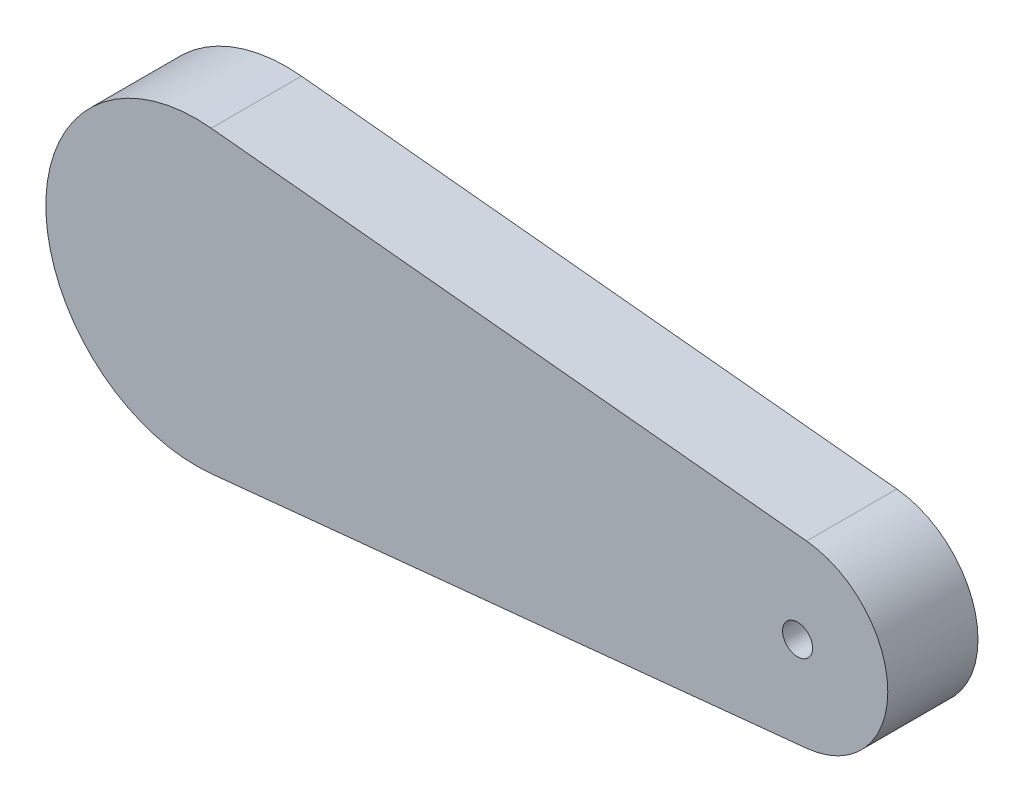
ISO-10303-21;
HEADER;
FILE_DESCRIPTION(('STEP AP214'),'2;1');
FILE_NAME('part.step','',(''),(''),'','','');
FILE_SCHEMA(('AUTOMOTIVE_DESIGN { 1 0 10303 214 1 1 1 1 }'));
ENDSEC;
DATA;
#1=APPLICATION_CONTEXT('core data for automotive mechanical design processes');
#2=APPLICATION_PROTOCOL_DEFINITION('international standard','automotive_design',2000,#1);
#3=PRODUCT_CONTEXT('',#1,'mechanical');
#4=PRODUCT('Part','Part','',(#3));
#5=PRODUCT_RELATED_PRODUCT_CATEGORY('part','',(#4));
#6=PRODUCT_DEFINITION_FORMATION('','',#4);
#7=PRODUCT_DEFINITION_CONTEXT('part definition',#1,'design');
#8=PRODUCT_DEFINITION('design','',#6,#7);
#9=PRODUCT_DEFINITION_SHAPE('','',#8);
#10=(LENGTH_UNIT() NAMED_UNIT(*) SI_UNIT(.MILLI.,.METRE.));
#11=(NAMED_UNIT(*) PLANE_ANGLE_UNIT() SI_UNIT($,.RADIAN.));
#12=(NAMED_UNIT(*) SI_UNIT($,.STERADIAN.) SOLID_ANGLE_UNIT());
#13=UNCERTAINTY_MEASURE_WITH_UNIT(LENGTH_MEASURE(1.E-05),#10,'distance_accuracy_value','');
#14=(GEOMETRIC_REPRESENTATION_CONTEXT(3) GLOBAL_UNCERTAINTY_ASSIGNED_CONTEXT((#13)) GLOBAL_UNIT_ASSIGNED_CONTEXT((#10,
#11,#12)) REPRESENTATION_CONTEXT('',''));
#15=CARTESIAN_POINT('',(0.,0.,0.));
#16=DIRECTION('',(0.,0.,1.));
#17=DIRECTION('',(1.,0.,0.));
#18=AXIS2_PLACEMENT_3D('',#15,#16,#17);
#19=CARTESIAN_POINT('',(0.,0.,30.));
#20=DIRECTION('',(0.,0.,-1.));
#21=DIRECTION('',(-1.,0.,0.));
#22=AXIS2_PLACEMENT_3D('',#19,#20,#21);
#23=CYLINDRICAL_SURFACE('',#22,50.);
#24=CARTESIAN_POINT('',(0.,0.,0.));
#25=DIRECTION('',(0.,0.,1.));
#26=DIRECTION('',(1.,0.,0.));
#27=AXIS2_PLACEMENT_3D('',#24,#25,#26);
#28=CIRCLE('',#27,50.);
#29=CARTESIAN_POINT('',(5.,49.749371855331,0.));
#30=VERTEX_POINT('',#29);
#31=CARTESIAN_POINT('',(5.,-49.749371855331,0.));
#32=VERTEX_POINT('',#31);
#33=EDGE_CURVE('E97',#30,#32,#28,.T.);
#34=ORIENTED_EDGE('',*,*,#33,.T.);
#35=DIRECTION('',(0.,0.,-1.));
#36=VECTOR('',#35,1.);
#37=CARTESIAN_POINT('',(5.,-49.749371855331,30.));
#38=LINE('',#37,#36);
#39=CARTESIAN_POINT('',(5.,-49.749371855331,30.));
#40=VERTEX_POINT('',#39);
#41=EDGE_CURVE('E11',#40,#32,#38,.T.);
#42=ORIENTED_EDGE('',*,*,#41,.F.);
#43=CARTESIAN_POINT('',(0.,0.,30.));
#44=DIRECTION('',(0.,0.,1.));
#45=DIRECTION('',(1.,0.,0.));
#46=AXIS2_PLACEMENT_3D('',#43,#44,#45);
#47=CIRCLE('',#46,50.);
#48=CARTESIAN_POINT('',(5.,49.749371855331,30.));
#49=VERTEX_POINT('',#48);
#50=EDGE_CURVE('E85',#49,#40,#47,.T.);
#51=ORIENTED_EDGE('',*,*,#50,.F.);
#52=DIRECTION('',(0.,0.,-1.));
#53=VECTOR('',#52,1.);
#54=CARTESIAN_POINT('',(5.,49.749371855331,30.));
#55=LINE('',#54,#53);
#56=EDGE_CURVE('E93',#49,#30,#55,.T.);
#57=ORIENTED_EDGE('',*,*,#56,.T.);
#58=EDGE_LOOP('',(#34,#42,#51,#57));
#59=FACE_BOUND('',#58,.T.);
#60=ADVANCED_FACE('F34',(#59),#23,.T.);
#61=CARTESIAN_POINT('',(5.,-49.749371855331,30.));
#62=DIRECTION('',(-0.1,0.99498743710662,0.));
#63=DIRECTION('',(-0.99498743710662,-0.1,0.));
#64=AXIS2_PLACEMENT_3D('',#61,#62,#63);
#65=PLANE('',#64);
#66=DIRECTION('',(0.99498743710662,0.1,0.));
#67=VECTOR('',#66,1.);
#68=CARTESIAN_POINT('',(5.,-49.749371855331,0.));
#69=LINE('',#68,#67);
#70=CARTESIAN_POINT('',(203.,-29.8496231131986,0.));
#71=VERTEX_POINT('',#70);
#72=EDGE_CURVE('E89',#32,#71,#69,.T.);
#73=ORIENTED_EDGE('',*,*,#72,.T.);
#74=DIRECTION('',(0.,0.,-1.));
#75=VECTOR('',#74,1.);
#76=CARTESIAN_POINT('',(203.,-29.8496231131986,30.));
#77=LINE('',#76,#75);
#78=CARTESIAN_POINT('',(203.,-29.8496231131986,30.));
#79=VERTEX_POINT('',#78);
#80=EDGE_CURVE('E42',#79,#71,#77,.T.);
#81=ORIENTED_EDGE('',*,*,#80,.F.);
#82=DIRECTION('',(0.99498743710662,0.1,0.));
#83=VECTOR('',#82,1.);
#84=CARTESIAN_POINT('',(5.,-49.749371855331,30.));
#85=LINE('',#84,#83);
#86=EDGE_CURVE('E80',#40,#79,#85,.T.);
#87=ORIENTED_EDGE('',*,*,#86,.F.);
#88=ORIENTED_EDGE('',*,*,#41,.T.);
#89=EDGE_LOOP('',(#73,#81,#87,#88));
#90=FACE_BOUND('',#89,.T.);
#91=ADVANCED_FACE('F88',(#90),#65,.F.);
#92=CARTESIAN_POINT('',(200.,0.,30.));
#93=DIRECTION('',(0.,0.,-1.));
#94=DIRECTION('',(-1.,0.,0.));
#95=AXIS2_PLACEMENT_3D('',#92,#93,#94);
#96=CYLINDRICAL_SURFACE('',#95,30.);
#97=CARTESIAN_POINT('',(200.,0.,0.));
#98=DIRECTION('',(0.,0.,1.));
#99=DIRECTION('',(1.,0.,0.));
#100=AXIS2_PLACEMENT_3D('',#97,#98,#99);
#101=CIRCLE('',#100,30.);
#102=CARTESIAN_POINT('',(203.,29.8496231131986,0.));
#103=VERTEX_POINT('',#102);
#104=EDGE_CURVE('E67',#71,#103,#101,.T.);
#105=ORIENTED_EDGE('',*,*,#104,.T.);
#106=DIRECTION('',(0.,0.,-1.));
#107=VECTOR('',#106,1.);
#108=CARTESIAN_POINT('',(203.,29.8496231131986,30.));
#109=LINE('',#108,#107);
#110=CARTESIAN_POINT('',(203.,29.8496231131986,30.));
#111=VERTEX_POINT('',#110);
#112=EDGE_CURVE('E90',#111,#103,#109,.T.);
#113=ORIENTED_EDGE('',*,*,#112,.F.);
#114=CARTESIAN_POINT('',(200.,0.,30.));
#115=DIRECTION('',(0.,0.,1.));
#116=DIRECTION('',(1.,0.,0.));
#117=AXIS2_PLACEMENT_3D('',#114,#115,#116);
#118=CIRCLE('',#117,30.);
#119=EDGE_CURVE('E83',#79,#111,#118,.T.);
#120=ORIENTED_EDGE('',*,*,#119,.F.);
#121=ORIENTED_EDGE('',*,*,#80,.T.);
#122=EDGE_LOOP('',(#105,#113,#120,#121));
#123=FACE_BOUND('',#122,.T.);
#124=ADVANCED_FACE('F91',(#123),#96,.T.);
#125=CARTESIAN_POINT('',(5.,49.749371855331,30.));
#126=DIRECTION('',(-0.1,-0.99498743710662,0.));
#127=DIRECTION('',(0.99498743710662,-0.1,0.));
#128=AXIS2_PLACEMENT_3D('',#125,#126,#127);
#129=PLANE('',#128);
#130=DIRECTION('',(-0.99498743710662,0.1,0.));
#131=VECTOR('',#130,1.);
#132=CARTESIAN_POINT('',(5.,49.749371855331,0.));
#133=LINE('',#132,#131);
#134=EDGE_CURVE('E73',#103,#30,#133,.T.);
#135=ORIENTED_EDGE('',*,*,#134,.T.);
#136=ORIENTED_EDGE('',*,*,#56,.F.);
#137=DIRECTION('',(-0.99498743710662,0.1,0.));
#138=VECTOR('',#137,1.);
#139=CARTESIAN_POINT('',(5.,49.749371855331,30.));
#140=LINE('',#139,#138);
#141=EDGE_CURVE('E50',#111,#49,#140,.T.);
#142=ORIENTED_EDGE('',*,*,#141,.F.);
#143=ORIENTED_EDGE('',*,*,#112,.T.);
#144=EDGE_LOOP('',(#135,#136,#142,#143));
#145=FACE_BOUND('',#144,.T.);
#146=ADVANCED_FACE('F105',(#145),#129,.F.);
#147=CARTESIAN_POINT('',(0.,0.,30.));
#148=DIRECTION('',(0.,0.,1.));
#149=DIRECTION('',(1.,0.,0.));
#150=AXIS2_PLACEMENT_3D('',#147,#148,#149);
#151=PLANE('',#150);
#152=CARTESIAN_POINT('',(200.,0.,30.));
#153=DIRECTION('',(0.,0.,1.));
#154=DIRECTION('',(1.,0.,0.));
#155=AXIS2_PLACEMENT_3D('',#152,#153,#154);
#156=CIRCLE('',#155,4.99999999999999);
#157=CARTESIAN_POINT('',(205.,0.,30.));
#158=VERTEX_POINT('',#157);
#159=EDGE_CURVE('E117',#158,#158,#156,.T.);
#160=ORIENTED_EDGE('',*,*,#159,.F.);
#161=EDGE_LOOP('',(#160));
#162=FACE_BOUND('',#161,.T.);
#163=ORIENTED_EDGE('',*,*,#50,.T.);
#164=ORIENTED_EDGE('',*,*,#86,.T.);
#165=ORIENTED_EDGE('',*,*,#119,.T.);
#166=ORIENTED_EDGE('',*,*,#141,.T.);
#167=EDGE_LOOP('',(#163,#164,#165,#166));
#168=FACE_BOUND('',#167,.T.);
#169=ADVANCED_FACE('F81',(#162,#168),#151,.T.);
#170=CARTESIAN_POINT('',(0.,0.,0.));
#171=DIRECTION('',(0.,0.,1.));
#172=DIRECTION('',(1.,0.,0.));
#173=AXIS2_PLACEMENT_3D('',#170,#171,#172);
#174=PLANE('',#173);
#175=CARTESIAN_POINT('',(0.,0.,0.));
#176=DIRECTION('',(0.,0.,-1.));
#177=DIRECTION('',(-1.,0.,0.));
#178=AXIS2_PLACEMENT_3D('',#175,#176,#177);
#179=CIRCLE('',#178,5.);
#180=CARTESIAN_POINT('',(-5.,0.,0.));
#181=VERTEX_POINT('',#180);
#182=EDGE_CURVE('E111',#181,#181,#179,.T.);
#183=ORIENTED_EDGE('',*,*,#182,.F.);
#184=EDGE_LOOP('',(#183));
#185=FACE_BOUND('',#184,.T.);
#186=ORIENTED_EDGE('',*,*,#33,.F.);
#187=ORIENTED_EDGE('',*,*,#134,.F.);
#188=ORIENTED_EDGE('',*,*,#104,.F.);
#189=ORIENTED_EDGE('',*,*,#72,.F.);
#190=EDGE_LOOP('',(#186,#187,#188,#189));
#191=FACE_BOUND('',#190,.T.);
#192=ADVANCED_FACE('F108',(#185,#191),#174,.F.);
#193=CARTESIAN_POINT('',(0.,0.,10.));
#194=DIRECTION('',(0.,0.,-1.));
#195=DIRECTION('',(-1.,0.,0.));
#196=AXIS2_PLACEMENT_3D('',#193,#194,#195);
#197=CYLINDRICAL_SURFACE('',#196,5.);
#198=CARTESIAN_POINT('',(0.,0.,10.));
#199=DIRECTION('',(0.,0.,-1.));
#200=DIRECTION('',(-1.,0.,0.));
#201=AXIS2_PLACEMENT_3D('',#198,#199,#200);
#202=CIRCLE('',#201,5.);
#203=CARTESIAN_POINT('',(-5.,0.,10.));
#204=VERTEX_POINT('',#203);
#205=EDGE_CURVE('E100',#204,#204,#202,.T.);
#206=ORIENTED_EDGE('',*,*,#205,.F.);
#207=EDGE_LOOP('',(#206));
#208=FACE_BOUND('',#207,.T.);
#209=ORIENTED_EDGE('',*,*,#182,.T.);
#210=EDGE_LOOP('',(#209));
#211=FACE_BOUND('',#210,.T.);
#212=ADVANCED_FACE('F138',(#208,#211),#197,.F.);
#213=CARTESIAN_POINT('',(0.,0.,10.));
#214=DIRECTION('',(0.,0.,-1.));
#215=DIRECTION('',(-1.,0.,0.));
#216=AXIS2_PLACEMENT_3D('',#213,#214,#215);
#217=PLANE('',#216);
#218=ORIENTED_EDGE('',*,*,#205,.T.);
#219=EDGE_LOOP('',(#218));
#220=FACE_BOUND('',#219,.T.);
#221=ADVANCED_FACE('F128',(#220),#217,.T.);
#222=CARTESIAN_POINT('',(200.,0.,20.));
#223=DIRECTION('',(0.,0.,1.));
#224=DIRECTION('',(1.,0.,0.));
#225=AXIS2_PLACEMENT_3D('',#222,#223,#224);
#226=CYLINDRICAL_SURFACE('',#225,4.99999999999999);
#227=CARTESIAN_POINT('',(200.,0.,20.));
#228=DIRECTION('',(0.,0.,1.));
#229=DIRECTION('',(1.,0.,0.));
#230=AXIS2_PLACEMENT_3D('',#227,#228,#229);
#231=CIRCLE('',#230,4.99999999999999);
#232=CARTESIAN_POINT('',(205.,0.,20.));
#233=VERTEX_POINT('',#232);
#234=EDGE_CURVE('E114',#233,#233,#231,.T.);
#235=ORIENTED_EDGE('',*,*,#234,.F.);
#236=EDGE_LOOP('',(#235));
#237=FACE_BOUND('',#236,.T.);
#238=ORIENTED_EDGE('',*,*,#159,.T.);
#239=EDGE_LOOP('',(#238));
#240=FACE_BOUND('',#239,.T.);
#241=ADVANCED_FACE('F125',(#237,#240),#226,.F.);
#242=CARTESIAN_POINT('',(200.,0.,20.));
#243=DIRECTION('',(0.,0.,1.));
#244=DIRECTION('',(1.,0.,0.));
#245=AXIS2_PLACEMENT_3D('',#242,#243,#244);
#246=PLANE('',#245);
#247=ORIENTED_EDGE('',*,*,#234,.T.);
#248=EDGE_LOOP('',(#247));
#249=FACE_BOUND('',#248,.T.);
#250=ADVANCED_FACE('F123',(#249),#246,.T.);
#251=CLOSED_SHELL('',(#60,#91,#124,#146,#169,#192,#212,#221,#241,#250));
#252=MANIFOLD_SOLID_BREP('B2',#251);
#253=ADVANCED_BREP_SHAPE_REPRESENTATION('',(#18,#252),#14);
#254=SHAPE_DEFINITION_REPRESENTATION(#9,#253);
ENDSEC;
END-ISO-10303-21;
